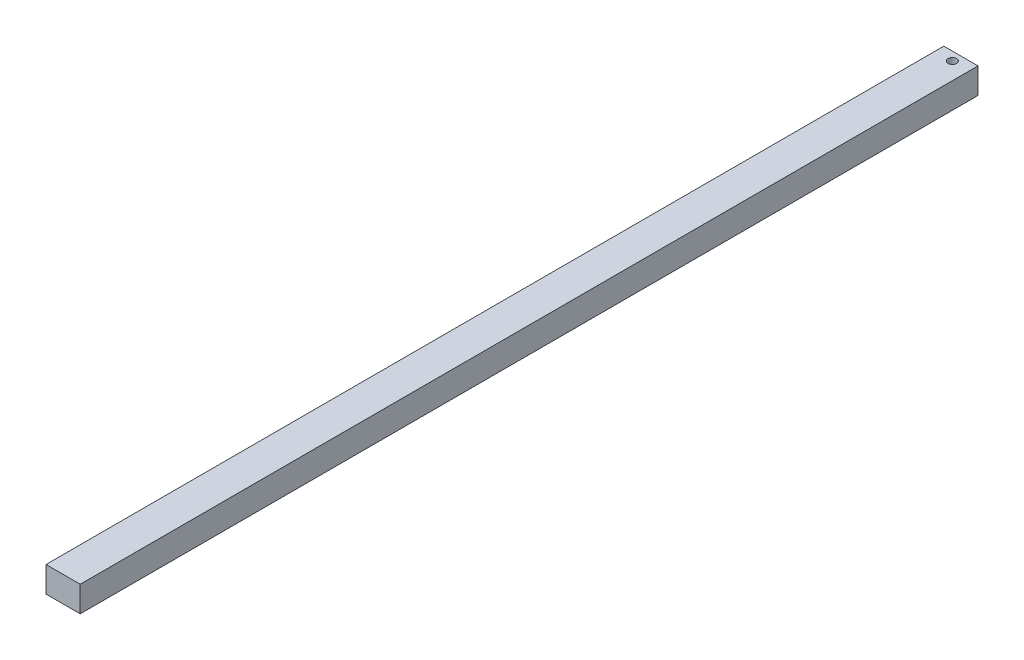
ISO-10303-21;
HEADER;
FILE_DESCRIPTION(('STEP AP214'),'2;1');
FILE_NAME('part.step','',(''),(''),'','','');
FILE_SCHEMA(('AUTOMOTIVE_DESIGN { 1 0 10303 214 1 1 1 1 }'));
ENDSEC;
DATA;
#1=APPLICATION_CONTEXT('core data for automotive mechanical design processes');
#2=APPLICATION_PROTOCOL_DEFINITION('international standard','automotive_design',2000,#1);
#3=PRODUCT_CONTEXT('',#1,'mechanical');
#4=PRODUCT('Part','Part','',(#3));
#5=PRODUCT_RELATED_PRODUCT_CATEGORY('part','',(#4));
#6=PRODUCT_DEFINITION_FORMATION('','',#4);
#7=PRODUCT_DEFINITION_CONTEXT('part definition',#1,'design');
#8=PRODUCT_DEFINITION('design','',#6,#7);
#9=PRODUCT_DEFINITION_SHAPE('','',#8);
#10=(LENGTH_UNIT() NAMED_UNIT(*) SI_UNIT(.MILLI.,.METRE.));
#11=(NAMED_UNIT(*) PLANE_ANGLE_UNIT() SI_UNIT($,.RADIAN.));
#12=(NAMED_UNIT(*) SI_UNIT($,.STERADIAN.) SOLID_ANGLE_UNIT());
#13=UNCERTAINTY_MEASURE_WITH_UNIT(LENGTH_MEASURE(1.E-05),#10,'distance_accuracy_value','');
#14=(GEOMETRIC_REPRESENTATION_CONTEXT(3) GLOBAL_UNCERTAINTY_ASSIGNED_CONTEXT((#13)) GLOBAL_UNIT_ASSIGNED_CONTEXT((#10,
#11,#12)) REPRESENTATION_CONTEXT('',''));
#15=CARTESIAN_POINT('',(0.,0.,0.));
#16=DIRECTION('',(0.,0.,1.));
#17=DIRECTION('',(1.,0.,0.));
#18=AXIS2_PLACEMENT_3D('',#15,#16,#17);
#19=CARTESIAN_POINT('',(0.,30.,0.));
#20=DIRECTION('',(0.,1.,0.));
#21=DIRECTION('',(0.,0.,1.));
#22=AXIS2_PLACEMENT_3D('',#19,#20,#21);
#23=PLANE('',#22);
#24=DIRECTION('',(0.,0.,-1.));
#25=VECTOR('',#24,1.);
#26=CARTESIAN_POINT('',(20.,30.,-525.));
#27=LINE('',#26,#25);
#28=CARTESIAN_POINT('',(20.,30.,525.));
#29=VERTEX_POINT('',#28);
#30=CARTESIAN_POINT('',(20.,30.,-525.));
#31=VERTEX_POINT('',#30);
#32=EDGE_CURVE('E177',#29,#31,#27,.T.);
#33=ORIENTED_EDGE('',*,*,#32,.T.);
#34=DIRECTION('',(-1.,0.,0.));
#35=VECTOR('',#34,1.);
#36=CARTESIAN_POINT('',(-20.,30.,-525.));
#37=LINE('',#36,#35);
#38=CARTESIAN_POINT('',(-20.,30.,-525.));
#39=VERTEX_POINT('',#38);
#40=EDGE_CURVE('E92',#31,#39,#37,.T.);
#41=ORIENTED_EDGE('',*,*,#40,.T.);
#42=DIRECTION('',(0.,0.,1.));
#43=VECTOR('',#42,1.);
#44=CARTESIAN_POINT('',(-20.,30.,-525.));
#45=LINE('',#44,#43);
#46=CARTESIAN_POINT('',(-20.,30.,525.));
#47=VERTEX_POINT('',#46);
#48=EDGE_CURVE('E182',#39,#47,#45,.T.);
#49=ORIENTED_EDGE('',*,*,#48,.T.);
#50=DIRECTION('',(1.,0.,0.));
#51=VECTOR('',#50,1.);
#52=CARTESIAN_POINT('',(-20.,30.,525.));
#53=LINE('',#52,#51);
#54=EDGE_CURVE('E64',#47,#29,#53,.T.);
#55=ORIENTED_EDGE('',*,*,#54,.T.);
#56=EDGE_LOOP('',(#33,#41,#49,#55));
#57=FACE_BOUND('',#56,.T.);
#58=CARTESIAN_POINT('',(0.,30.,-515.));
#59=DIRECTION('',(0.,1.,0.));
#60=DIRECTION('',(0.,0.,1.));
#61=AXIS2_PLACEMENT_3D('',#58,#59,#60);
#62=CIRCLE('',#61,5.);
#63=CARTESIAN_POINT('',(0.,30.,-510.));
#64=VERTEX_POINT('',#63);
#65=EDGE_CURVE('E169',#64,#64,#62,.T.);
#66=ORIENTED_EDGE('',*,*,#65,.F.);
#67=EDGE_LOOP('',(#66));
#68=FACE_BOUND('',#67,.T.);
#69=ADVANCED_FACE('F39',(#57,#68),#23,.T.);
#70=CARTESIAN_POINT('',(0.,0.,0.));
#71=DIRECTION('',(0.,1.,0.));
#72=DIRECTION('',(0.,0.,1.));
#73=AXIS2_PLACEMENT_3D('',#70,#71,#72);
#74=PLANE('',#73);
#75=DIRECTION('',(-1.,0.,0.));
#76=VECTOR('',#75,1.);
#77=CARTESIAN_POINT('',(-10.,0.,10.));
#78=LINE('',#77,#76);
#79=CARTESIAN_POINT('',(10.,0.,10.));
#80=VERTEX_POINT('',#79);
#81=CARTESIAN_POINT('',(-10.,0.,10.));
#82=VERTEX_POINT('',#81);
#83=EDGE_CURVE('E153',#80,#82,#78,.T.);
#84=ORIENTED_EDGE('',*,*,#83,.F.);
#85=DIRECTION('',(0.,0.,1.));
#86=VECTOR('',#85,1.);
#87=CARTESIAN_POINT('',(10.,0.,10.));
#88=LINE('',#87,#86);
#89=CARTESIAN_POINT('',(10.,0.,-10.));
#90=VERTEX_POINT('',#89);
#91=EDGE_CURVE('E55',#90,#80,#88,.T.);
#92=ORIENTED_EDGE('',*,*,#91,.F.);
#93=DIRECTION('',(1.,0.,0.));
#94=VECTOR('',#93,1.);
#95=CARTESIAN_POINT('',(-10.,0.,-10.));
#96=LINE('',#95,#94);
#97=CARTESIAN_POINT('',(-10.,0.,-10.));
#98=VERTEX_POINT('',#97);
#99=EDGE_CURVE('E137',#98,#90,#96,.T.);
#100=ORIENTED_EDGE('',*,*,#99,.F.);
#101=DIRECTION('',(0.,0.,-1.));
#102=VECTOR('',#101,1.);
#103=CARTESIAN_POINT('',(-10.,0.,10.));
#104=LINE('',#103,#102);
#105=EDGE_CURVE('E141',#82,#98,#104,.T.);
#106=ORIENTED_EDGE('',*,*,#105,.F.);
#107=EDGE_LOOP('',(#84,#92,#100,#106));
#108=FACE_BOUND('',#107,.T.);
#109=DIRECTION('',(0.,0.,-1.));
#110=VECTOR('',#109,1.);
#111=CARTESIAN_POINT('',(20.,0.,-525.));
#112=LINE('',#111,#110);
#113=CARTESIAN_POINT('',(20.,0.,525.));
#114=VERTEX_POINT('',#113);
#115=CARTESIAN_POINT('',(20.,0.,-525.));
#116=VERTEX_POINT('',#115);
#117=EDGE_CURVE('E173',#114,#116,#112,.T.);
#118=ORIENTED_EDGE('',*,*,#117,.F.);
#119=DIRECTION('',(1.,0.,0.));
#120=VECTOR('',#119,1.);
#121=CARTESIAN_POINT('',(-20.,0.,525.));
#122=LINE('',#121,#120);
#123=CARTESIAN_POINT('',(-20.,0.,525.));
#124=VERTEX_POINT('',#123);
#125=EDGE_CURVE('E85',#124,#114,#122,.T.);
#126=ORIENTED_EDGE('',*,*,#125,.F.);
#127=DIRECTION('',(0.,0.,1.));
#128=VECTOR('',#127,1.);
#129=CARTESIAN_POINT('',(-20.,0.,-525.));
#130=LINE('',#129,#128);
#131=CARTESIAN_POINT('',(-20.,0.,-525.));
#132=VERTEX_POINT('',#131);
#133=EDGE_CURVE('E194',#132,#124,#130,.T.);
#134=ORIENTED_EDGE('',*,*,#133,.F.);
#135=DIRECTION('',(-1.,0.,0.));
#136=VECTOR('',#135,1.);
#137=CARTESIAN_POINT('',(-20.,0.,-525.));
#138=LINE('',#137,#136);
#139=EDGE_CURVE('E191',#116,#132,#138,.T.);
#140=ORIENTED_EDGE('',*,*,#139,.F.);
#141=EDGE_LOOP('',(#118,#126,#134,#140));
#142=FACE_BOUND('',#141,.T.);
#143=CARTESIAN_POINT('',(0.,0.,-515.));
#144=DIRECTION('',(0.,1.,0.));
#145=DIRECTION('',(0.,0.,1.));
#146=AXIS2_PLACEMENT_3D('',#143,#144,#145);
#147=CIRCLE('',#146,5.);
#148=CARTESIAN_POINT('',(0.,0.,-510.));
#149=VERTEX_POINT('',#148);
#150=EDGE_CURVE('E163',#149,#149,#147,.T.);
#151=ORIENTED_EDGE('',*,*,#150,.T.);
#152=EDGE_LOOP('',(#151));
#153=FACE_BOUND('',#152,.T.);
#154=ADVANCED_FACE('F212',(#108,#142,#153),#74,.F.);
#155=CARTESIAN_POINT('',(20.,30.,-525.));
#156=DIRECTION('',(-1.,0.,0.));
#157=DIRECTION('',(0.,0.,1.));
#158=AXIS2_PLACEMENT_3D('',#155,#156,#157);
#159=PLANE('',#158);
#160=ORIENTED_EDGE('',*,*,#117,.T.);
#161=DIRECTION('',(0.,-1.,0.));
#162=VECTOR('',#161,1.);
#163=CARTESIAN_POINT('',(20.,30.,-525.));
#164=LINE('',#163,#162);
#165=EDGE_CURVE('E11',#31,#116,#164,.T.);
#166=ORIENTED_EDGE('',*,*,#165,.F.);
#167=ORIENTED_EDGE('',*,*,#32,.F.);
#168=DIRECTION('',(0.,-1.,0.));
#169=VECTOR('',#168,1.);
#170=CARTESIAN_POINT('',(20.,30.,525.));
#171=LINE('',#170,#169);
#172=EDGE_CURVE('E187',#29,#114,#171,.T.);
#173=ORIENTED_EDGE('',*,*,#172,.T.);
#174=EDGE_LOOP('',(#160,#166,#167,#173));
#175=FACE_BOUND('',#174,.T.);
#176=ADVANCED_FACE('F41',(#175),#159,.F.);
#177=CARTESIAN_POINT('',(-20.,30.,-525.));
#178=DIRECTION('',(0.,0.,1.));
#179=DIRECTION('',(1.,0.,0.));
#180=AXIS2_PLACEMENT_3D('',#177,#178,#179);
#181=PLANE('',#180);
#182=ORIENTED_EDGE('',*,*,#139,.T.);
#183=DIRECTION('',(0.,-1.,0.));
#184=VECTOR('',#183,1.);
#185=CARTESIAN_POINT('',(-20.,30.,-525.));
#186=LINE('',#185,#184);
#187=EDGE_CURVE('E48',#39,#132,#186,.T.);
#188=ORIENTED_EDGE('',*,*,#187,.F.);
#189=ORIENTED_EDGE('',*,*,#40,.F.);
#190=ORIENTED_EDGE('',*,*,#165,.T.);
#191=EDGE_LOOP('',(#182,#188,#189,#190));
#192=FACE_BOUND('',#191,.T.);
#193=ADVANCED_FACE('F227',(#192),#181,.F.);
#194=CARTESIAN_POINT('',(-20.,30.,-525.));
#195=DIRECTION('',(1.,0.,0.));
#196=DIRECTION('',(0.,0.,-1.));
#197=AXIS2_PLACEMENT_3D('',#194,#195,#196);
#198=PLANE('',#197);
#199=ORIENTED_EDGE('',*,*,#133,.T.);
#200=DIRECTION('',(0.,-1.,0.));
#201=VECTOR('',#200,1.);
#202=CARTESIAN_POINT('',(-20.,30.,525.));
#203=LINE('',#202,#201);
#204=EDGE_CURVE('E201',#47,#124,#203,.T.);
#205=ORIENTED_EDGE('',*,*,#204,.F.);
#206=ORIENTED_EDGE('',*,*,#48,.F.);
#207=ORIENTED_EDGE('',*,*,#187,.T.);
#208=EDGE_LOOP('',(#199,#205,#206,#207));
#209=FACE_BOUND('',#208,.T.);
#210=ADVANCED_FACE('F208',(#209),#198,.F.);
#211=CARTESIAN_POINT('',(-20.,30.,525.));
#212=DIRECTION('',(0.,0.,-1.));
#213=DIRECTION('',(-1.,0.,0.));
#214=AXIS2_PLACEMENT_3D('',#211,#212,#213);
#215=PLANE('',#214);
#216=ORIENTED_EDGE('',*,*,#125,.T.);
#217=ORIENTED_EDGE('',*,*,#172,.F.);
#218=ORIENTED_EDGE('',*,*,#54,.F.);
#219=ORIENTED_EDGE('',*,*,#204,.T.);
#220=EDGE_LOOP('',(#216,#217,#218,#219));
#221=FACE_BOUND('',#220,.T.);
#222=ADVANCED_FACE('F217',(#221),#215,.F.);
#223=CARTESIAN_POINT('',(0.,30.,-515.));
#224=DIRECTION('',(0.,-1.,0.));
#225=DIRECTION('',(0.,0.,-1.));
#226=AXIS2_PLACEMENT_3D('',#223,#224,#225);
#227=CYLINDRICAL_SURFACE('',#226,5.);
#228=ORIENTED_EDGE('',*,*,#65,.T.);
#229=EDGE_LOOP('',(#228));
#230=FACE_BOUND('',#229,.T.);
#231=ORIENTED_EDGE('',*,*,#150,.F.);
#232=EDGE_LOOP('',(#231));
#233=FACE_BOUND('',#232,.T.);
#234=ADVANCED_FACE('F219',(#230,#233),#227,.F.);
#235=CARTESIAN_POINT('',(10.,15.,10.));
#236=DIRECTION('',(1.,0.,0.));
#237=DIRECTION('',(0.,0.,-1.));
#238=AXIS2_PLACEMENT_3D('',#235,#236,#237);
#239=PLANE('',#238);
#240=ORIENTED_EDGE('',*,*,#91,.T.);
#241=DIRECTION('',(0.,-1.,0.));
#242=VECTOR('',#241,1.);
#243=CARTESIAN_POINT('',(10.,15.,10.));
#244=LINE('',#243,#242);
#245=CARTESIAN_POINT('',(10.,15.,10.));
#246=VERTEX_POINT('',#245);
#247=EDGE_CURVE('E112',#246,#80,#244,.T.);
#248=ORIENTED_EDGE('',*,*,#247,.F.);
#249=DIRECTION('',(0.,0.,1.));
#250=VECTOR('',#249,1.);
#251=CARTESIAN_POINT('',(10.,15.,10.));
#252=LINE('',#251,#250);
#253=CARTESIAN_POINT('',(10.,15.,-10.));
#254=VERTEX_POINT('',#253);
#255=EDGE_CURVE('E116',#254,#246,#252,.T.);
#256=ORIENTED_EDGE('',*,*,#255,.F.);
#257=DIRECTION('',(0.,-1.,0.));
#258=VECTOR('',#257,1.);
#259=CARTESIAN_POINT('',(10.,15.,-10.));
#260=LINE('',#259,#258);
#261=EDGE_CURVE('E160',#254,#90,#260,.T.);
#262=ORIENTED_EDGE('',*,*,#261,.T.);
#263=EDGE_LOOP('',(#240,#248,#256,#262));
#264=FACE_BOUND('',#263,.T.);
#265=ADVANCED_FACE('F114',(#264),#239,.F.);
#266=CARTESIAN_POINT('',(-10.,15.,-10.));
#267=DIRECTION('',(0.,0.,-1.));
#268=DIRECTION('',(-1.,0.,0.));
#269=AXIS2_PLACEMENT_3D('',#266,#267,#268);
#270=PLANE('',#269);
#271=ORIENTED_EDGE('',*,*,#99,.T.);
#272=ORIENTED_EDGE('',*,*,#261,.F.);
#273=DIRECTION('',(1.,0.,0.));
#274=VECTOR('',#273,1.);
#275=CARTESIAN_POINT('',(-10.,15.,-10.));
#276=LINE('',#275,#274);
#277=CARTESIAN_POINT('',(-10.,15.,-10.));
#278=VERTEX_POINT('',#277);
#279=EDGE_CURVE('E123',#278,#254,#276,.T.);
#280=ORIENTED_EDGE('',*,*,#279,.F.);
#281=DIRECTION('',(0.,-1.,0.));
#282=VECTOR('',#281,1.);
#283=CARTESIAN_POINT('',(-10.,15.,-10.));
#284=LINE('',#283,#282);
#285=EDGE_CURVE('E164',#278,#98,#284,.T.);
#286=ORIENTED_EDGE('',*,*,#285,.T.);
#287=EDGE_LOOP('',(#271,#272,#280,#286));
#288=FACE_BOUND('',#287,.T.);
#289=ADVANCED_FACE('F240',(#288),#270,.F.);
#290=CARTESIAN_POINT('',(-10.,15.,10.));
#291=DIRECTION('',(-1.,0.,0.));
#292=DIRECTION('',(0.,0.,1.));
#293=AXIS2_PLACEMENT_3D('',#290,#291,#292);
#294=PLANE('',#293);
#295=ORIENTED_EDGE('',*,*,#105,.T.);
#296=ORIENTED_EDGE('',*,*,#285,.F.);
#297=DIRECTION('',(0.,0.,-1.));
#298=VECTOR('',#297,1.);
#299=CARTESIAN_POINT('',(-10.,15.,10.));
#300=LINE('',#299,#298);
#301=CARTESIAN_POINT('',(-10.,15.,10.));
#302=VERTEX_POINT('',#301);
#303=EDGE_CURVE('E132',#302,#278,#300,.T.);
#304=ORIENTED_EDGE('',*,*,#303,.F.);
#305=DIRECTION('',(0.,-1.,0.));
#306=VECTOR('',#305,1.);
#307=CARTESIAN_POINT('',(-10.,15.,10.));
#308=LINE('',#307,#306);
#309=EDGE_CURVE('E122',#302,#82,#308,.T.);
#310=ORIENTED_EDGE('',*,*,#309,.T.);
#311=EDGE_LOOP('',(#295,#296,#304,#310));
#312=FACE_BOUND('',#311,.T.);
#313=ADVANCED_FACE('F243',(#312),#294,.F.);
#314=CARTESIAN_POINT('',(-10.,15.,10.));
#315=DIRECTION('',(0.,0.,1.));
#316=DIRECTION('',(1.,0.,0.));
#317=AXIS2_PLACEMENT_3D('',#314,#315,#316);
#318=PLANE('',#317);
#319=CARTESIAN_POINT('',(5.,5.5,10.));
#320=DIRECTION('',(0.,0.,-1.));
#321=DIRECTION('',(-1.,0.,0.));
#322=AXIS2_PLACEMENT_3D('',#319,#320,#321);
#323=CIRCLE('',#322,3.);
#324=CARTESIAN_POINT('',(2.,5.5,10.));
#325=VERTEX_POINT('',#324);
#326=EDGE_CURVE('E144',#325,#325,#323,.T.);
#327=ORIENTED_EDGE('',*,*,#326,.F.);
#328=EDGE_LOOP('',(#327));
#329=FACE_BOUND('',#328,.T.);
#330=ORIENTED_EDGE('',*,*,#83,.T.);
#331=ORIENTED_EDGE('',*,*,#309,.F.);
#332=DIRECTION('',(-1.,0.,0.));
#333=VECTOR('',#332,1.);
#334=CARTESIAN_POINT('',(-10.,15.,10.));
#335=LINE('',#334,#333);
#336=EDGE_CURVE('E126',#246,#302,#335,.T.);
#337=ORIENTED_EDGE('',*,*,#336,.F.);
#338=ORIENTED_EDGE('',*,*,#247,.T.);
#339=EDGE_LOOP('',(#330,#331,#337,#338));
#340=FACE_BOUND('',#339,.T.);
#341=ADVANCED_FACE('F127',(#329,#340),#318,.F.);
#342=CARTESIAN_POINT('',(0.,15.,0.));
#343=DIRECTION('',(0.,-1.,0.));
#344=DIRECTION('',(0.,0.,-1.));
#345=AXIS2_PLACEMENT_3D('',#342,#343,#344);
#346=PLANE('',#345);
#347=ORIENTED_EDGE('',*,*,#255,.T.);
#348=ORIENTED_EDGE('',*,*,#336,.T.);
#349=ORIENTED_EDGE('',*,*,#303,.T.);
#350=ORIENTED_EDGE('',*,*,#279,.T.);
#351=EDGE_LOOP('',(#347,#348,#349,#350));
#352=FACE_BOUND('',#351,.T.);
#353=ADVANCED_FACE('F134',(#352),#346,.T.);
#354=CARTESIAN_POINT('',(5.,5.5,30.));
#355=DIRECTION('',(0.,0.,-1.));
#356=DIRECTION('',(-1.,0.,0.));
#357=AXIS2_PLACEMENT_3D('',#354,#355,#356);
#358=CYLINDRICAL_SURFACE('',#357,3.);
#359=CARTESIAN_POINT('',(5.,5.5,30.));
#360=DIRECTION('',(0.,0.,-1.));
#361=DIRECTION('',(-1.,0.,0.));
#362=AXIS2_PLACEMENT_3D('',#359,#360,#361);
#363=CIRCLE('',#362,3.);
#364=CARTESIAN_POINT('',(2.,5.5,30.));
#365=VERTEX_POINT('',#364);
#366=EDGE_CURVE('E154',#365,#365,#363,.T.);
#367=ORIENTED_EDGE('',*,*,#366,.F.);
#368=EDGE_LOOP('',(#367));
#369=FACE_BOUND('',#368,.T.);
#370=ORIENTED_EDGE('',*,*,#326,.T.);
#371=EDGE_LOOP('',(#370));
#372=FACE_BOUND('',#371,.T.);
#373=ADVANCED_FACE('F253',(#369,#372),#358,.F.);
#374=CARTESIAN_POINT('',(5.,5.5,30.));
#375=DIRECTION('',(0.,0.,-1.));
#376=DIRECTION('',(-1.,0.,0.));
#377=AXIS2_PLACEMENT_3D('',#374,#375,#376);
#378=PLANE('',#377);
#379=ORIENTED_EDGE('',*,*,#366,.T.);
#380=EDGE_LOOP('',(#379));
#381=FACE_BOUND('',#380,.T.);
#382=ADVANCED_FACE('F256',(#381),#378,.T.);
#383=CLOSED_SHELL('',(#69,#154,#176,#193,#210,#222,#234,#265,#289,#313,#341,#353,#373,#382));
#384=MANIFOLD_SOLID_BREP('B2',#383);
#385=ADVANCED_BREP_SHAPE_REPRESENTATION('',(#18,#384),#14);
#386=SHAPE_DEFINITION_REPRESENTATION(#9,#385);
ENDSEC;
END-ISO-10303-21;
